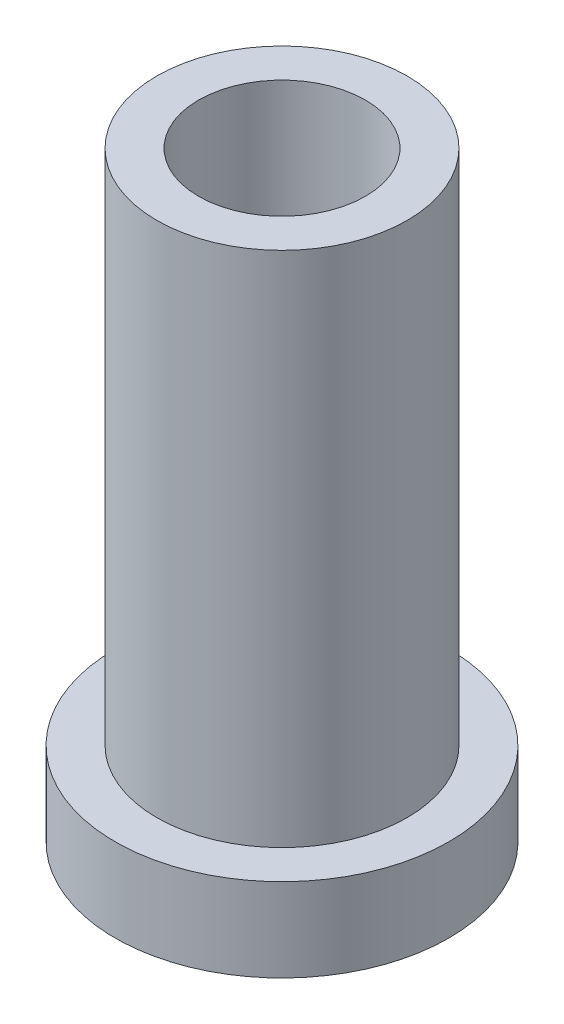
ISO-10303-21;
HEADER;
FILE_DESCRIPTION(('STEP AP214'),'2;1');
FILE_NAME('part.step','',(''),(''),'','','');
FILE_SCHEMA(('AUTOMOTIVE_DESIGN { 1 0 10303 214 1 1 1 1 }'));
ENDSEC;
DATA;
#1=APPLICATION_CONTEXT('core data for automotive mechanical design processes');
#2=APPLICATION_PROTOCOL_DEFINITION('international standard','automotive_design',2000,#1);
#3=PRODUCT_CONTEXT('',#1,'mechanical');
#4=PRODUCT('Part','Part','',(#3));
#5=PRODUCT_RELATED_PRODUCT_CATEGORY('part','',(#4));
#6=PRODUCT_DEFINITION_FORMATION('','',#4);
#7=PRODUCT_DEFINITION_CONTEXT('part definition',#1,'design');
#8=PRODUCT_DEFINITION('design','',#6,#7);
#9=PRODUCT_DEFINITION_SHAPE('','',#8);
#10=(LENGTH_UNIT() NAMED_UNIT(*) SI_UNIT(.MILLI.,.METRE.));
#11=(NAMED_UNIT(*) PLANE_ANGLE_UNIT() SI_UNIT($,.RADIAN.));
#12=(NAMED_UNIT(*) SI_UNIT($,.STERADIAN.) SOLID_ANGLE_UNIT());
#13=UNCERTAINTY_MEASURE_WITH_UNIT(LENGTH_MEASURE(1.E-05),#10,'distance_accuracy_value','');
#14=(GEOMETRIC_REPRESENTATION_CONTEXT(3) GLOBAL_UNCERTAINTY_ASSIGNED_CONTEXT((#13)) GLOBAL_UNIT_ASSIGNED_CONTEXT((#10,
#11,#12)) REPRESENTATION_CONTEXT('',''));
#15=CARTESIAN_POINT('',(0.,0.,0.));
#16=DIRECTION('',(0.,0.,1.));
#17=DIRECTION('',(1.,0.,0.));
#18=AXIS2_PLACEMENT_3D('',#15,#16,#17);
#19=CARTESIAN_POINT('',(0.,0.,0.));
#20=DIRECTION('',(0.,1.,0.));
#21=DIRECTION('',(-1.,0.,0.));
#22=AXIS2_PLACEMENT_3D('',#19,#20,#21);
#23=PLANE('',#22);
#24=CARTESIAN_POINT('',(0.,0.,0.));
#25=DIRECTION('',(0.,1.,0.));
#26=DIRECTION('',(-1.,0.,0.));
#27=AXIS2_PLACEMENT_3D('',#24,#25,#26);
#28=CIRCLE('',#27,5.);
#29=CARTESIAN_POINT('',(-5.,0.,0.));
#30=VERTEX_POINT('',#29);
#31=EDGE_CURVE('E58',#30,#30,#28,.T.);
#32=ORIENTED_EDGE('',*,*,#31,.T.);
#33=EDGE_LOOP('',(#32));
#34=FACE_BOUND('',#33,.T.);
#35=CARTESIAN_POINT('',(0.,0.,0.));
#36=DIRECTION('',(0.,1.,0.));
#37=DIRECTION('',(-1.,0.,0.));
#38=AXIS2_PLACEMENT_3D('',#35,#36,#37);
#39=CIRCLE('',#38,10.);
#40=CARTESIAN_POINT('',(-9.99999999999999,0.,0.));
#41=VERTEX_POINT('',#40);
#42=EDGE_CURVE('E10',#41,#41,#39,.T.);
#43=ORIENTED_EDGE('',*,*,#42,.F.);
#44=EDGE_LOOP('',(#43));
#45=FACE_BOUND('',#44,.T.);
#46=ADVANCED_FACE('F39',(#34,#45),#23,.F.);
#47=CARTESIAN_POINT('',(0.,41.,0.));
#48=DIRECTION('',(0.,1.,0.));
#49=DIRECTION('',(-1.,0.,0.));
#50=AXIS2_PLACEMENT_3D('',#47,#48,#49);
#51=CYLINDRICAL_SURFACE('',#50,10.);
#52=CARTESIAN_POINT('',(0.,5.,0.));
#53=DIRECTION('',(0.,1.,0.));
#54=DIRECTION('',(-1.,0.,0.));
#55=AXIS2_PLACEMENT_3D('',#52,#53,#54);
#56=CIRCLE('',#55,10.);
#57=CARTESIAN_POINT('',(-9.99999999999999,5.,0.));
#58=VERTEX_POINT('',#57);
#59=EDGE_CURVE('E45',#58,#58,#56,.T.);
#60=ORIENTED_EDGE('',*,*,#59,.F.);
#61=EDGE_LOOP('',(#60));
#62=FACE_BOUND('',#61,.T.);
#63=ORIENTED_EDGE('',*,*,#42,.T.);
#64=EDGE_LOOP('',(#63));
#65=FACE_BOUND('',#64,.T.);
#66=ADVANCED_FACE('F87',(#62,#65),#51,.T.);
#67=CARTESIAN_POINT('',(10.,5.,0.));
#68=DIRECTION('',(0.,-1.,0.));
#69=DIRECTION('',(1.,0.,0.));
#70=AXIS2_PLACEMENT_3D('',#67,#68,#69);
#71=PLANE('',#70);
#72=CARTESIAN_POINT('',(0.,5.,0.));
#73=DIRECTION('',(0.,1.,0.));
#74=DIRECTION('',(-1.,0.,0.));
#75=AXIS2_PLACEMENT_3D('',#72,#73,#74);
#76=CIRCLE('',#75,7.5);
#77=CARTESIAN_POINT('',(-7.49999999999999,5.,0.));
#78=VERTEX_POINT('',#77);
#79=EDGE_CURVE('E49',#78,#78,#76,.T.);
#80=ORIENTED_EDGE('',*,*,#79,.F.);
#81=EDGE_LOOP('',(#80));
#82=FACE_BOUND('',#81,.T.);
#83=ORIENTED_EDGE('',*,*,#59,.T.);
#84=EDGE_LOOP('',(#83));
#85=FACE_BOUND('',#84,.T.);
#86=ADVANCED_FACE('F82',(#82,#85),#71,.F.);
#87=CARTESIAN_POINT('',(0.,41.,0.));
#88=DIRECTION('',(0.,1.,0.));
#89=DIRECTION('',(-1.,0.,0.));
#90=AXIS2_PLACEMENT_3D('',#87,#88,#89);
#91=CYLINDRICAL_SURFACE('',#90,7.5);
#92=CARTESIAN_POINT('',(0.,36.,0.));
#93=DIRECTION('',(0.,1.,0.));
#94=DIRECTION('',(-1.,0.,0.));
#95=AXIS2_PLACEMENT_3D('',#92,#93,#94);
#96=CIRCLE('',#95,7.5);
#97=CARTESIAN_POINT('',(-7.5,36.,0.));
#98=VERTEX_POINT('',#97);
#99=EDGE_CURVE('E53',#98,#98,#96,.T.);
#100=ORIENTED_EDGE('',*,*,#99,.F.);
#101=EDGE_LOOP('',(#100));
#102=FACE_BOUND('',#101,.T.);
#103=ORIENTED_EDGE('',*,*,#79,.T.);
#104=EDGE_LOOP('',(#103));
#105=FACE_BOUND('',#104,.T.);
#106=ADVANCED_FACE('F76',(#102,#105),#91,.T.);
#107=CARTESIAN_POINT('',(7.5,36.,0.));
#108=DIRECTION('',(0.,-1.,0.));
#109=DIRECTION('',(1.,0.,0.));
#110=AXIS2_PLACEMENT_3D('',#107,#108,#109);
#111=PLANE('',#110);
#112=CARTESIAN_POINT('',(0.,36.,0.));
#113=DIRECTION('',(0.,1.,0.));
#114=DIRECTION('',(-1.,0.,0.));
#115=AXIS2_PLACEMENT_3D('',#112,#113,#114);
#116=CIRCLE('',#115,5.);
#117=CARTESIAN_POINT('',(-5.00000000000001,36.,0.));
#118=VERTEX_POINT('',#117);
#119=EDGE_CURVE('E59',#118,#118,#116,.T.);
#120=ORIENTED_EDGE('',*,*,#119,.F.);
#121=EDGE_LOOP('',(#120));
#122=FACE_BOUND('',#121,.T.);
#123=ORIENTED_EDGE('',*,*,#99,.T.);
#124=EDGE_LOOP('',(#123));
#125=FACE_BOUND('',#124,.T.);
#126=ADVANCED_FACE('F70',(#122,#125),#111,.F.);
#127=CARTESIAN_POINT('',(0.,0.,0.));
#128=DIRECTION('',(0.,1.,0.));
#129=DIRECTION('',(-1.,0.,0.));
#130=AXIS2_PLACEMENT_3D('',#127,#128,#129);
#131=CYLINDRICAL_SURFACE('',#130,5.);
#132=ORIENTED_EDGE('',*,*,#31,.F.);
#133=EDGE_LOOP('',(#132));
#134=FACE_BOUND('',#133,.T.);
#135=ORIENTED_EDGE('',*,*,#119,.T.);
#136=EDGE_LOOP('',(#135));
#137=FACE_BOUND('',#136,.T.);
#138=ADVANCED_FACE('F67',(#134,#137),#131,.F.);
#139=CLOSED_SHELL('',(#46,#66,#86,#106,#126,#138));
#140=MANIFOLD_SOLID_BREP('B2',#139);
#141=ADVANCED_BREP_SHAPE_REPRESENTATION('',(#18,#140),#14);
#142=SHAPE_DEFINITION_REPRESENTATION(#9,#141);
ENDSEC;
END-ISO-10303-21;
